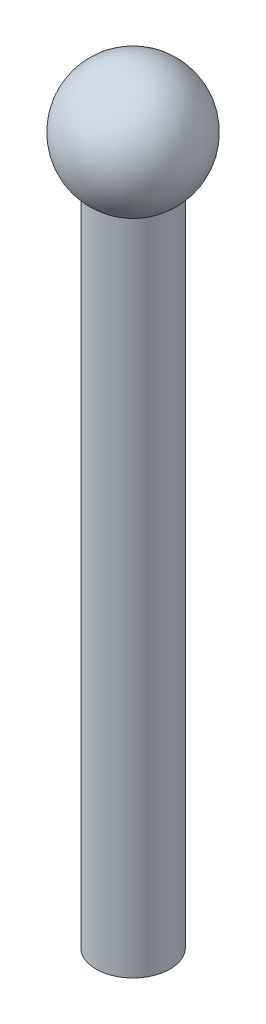
ISO-10303-21;
HEADER;
FILE_DESCRIPTION(('STEP AP214'),'2;1');
FILE_NAME('part.step','',(''),(''),'','','');
FILE_SCHEMA(('AUTOMOTIVE_DESIGN { 1 0 10303 214 1 1 1 1 }'));
ENDSEC;
DATA;
#1=APPLICATION_CONTEXT('core data for automotive mechanical design processes');
#2=APPLICATION_PROTOCOL_DEFINITION('international standard','automotive_design',2000,#1);
#3=PRODUCT_CONTEXT('',#1,'mechanical');
#4=PRODUCT('Part','Part','',(#3));
#5=PRODUCT_RELATED_PRODUCT_CATEGORY('part','',(#4));
#6=PRODUCT_DEFINITION_FORMATION('','',#4);
#7=PRODUCT_DEFINITION_CONTEXT('part definition',#1,'design');
#8=PRODUCT_DEFINITION('design','',#6,#7);
#9=PRODUCT_DEFINITION_SHAPE('','',#8);
#10=(LENGTH_UNIT() NAMED_UNIT(*) SI_UNIT(.MILLI.,.METRE.));
#11=(NAMED_UNIT(*) PLANE_ANGLE_UNIT() SI_UNIT($,.RADIAN.));
#12=(NAMED_UNIT(*) SI_UNIT($,.STERADIAN.) SOLID_ANGLE_UNIT());
#13=UNCERTAINTY_MEASURE_WITH_UNIT(LENGTH_MEASURE(1.E-05),#10,'distance_accuracy_value','');
#14=(GEOMETRIC_REPRESENTATION_CONTEXT(3) GLOBAL_UNCERTAINTY_ASSIGNED_CONTEXT((#13)) GLOBAL_UNIT_ASSIGNED_CONTEXT((#10,
#11,#12)) REPRESENTATION_CONTEXT('',''));
#15=CARTESIAN_POINT('',(0.,0.,0.));
#16=DIRECTION('',(0.,0.,1.));
#17=DIRECTION('',(1.,0.,0.));
#18=AXIS2_PLACEMENT_3D('',#15,#16,#17);
#19=CARTESIAN_POINT('',(0.,120.,0.));
#20=DIRECTION('',(0.,-1.,0.));
#21=DIRECTION('',(0.,0.,-1.));
#22=AXIS2_PLACEMENT_3D('',#19,#20,#21);
#23=CYLINDRICAL_SURFACE('',#22,6.75);
#24=CARTESIAN_POINT('',(0.,120.,0.));
#25=DIRECTION('',(0.,1.,0.));
#26=DIRECTION('',(0.,0.,1.));
#27=AXIS2_PLACEMENT_3D('',#24,#25,#26);
#28=CIRCLE('',#27,6.75);
#29=CARTESIAN_POINT('',(0.,120.,6.75));
#30=VERTEX_POINT('',#29);
#31=EDGE_CURVE('E10',#30,#30,#28,.T.);
#32=ORIENTED_EDGE('',*,*,#31,.F.);
#33=EDGE_LOOP('',(#32));
#34=FACE_BOUND('',#33,.T.);
#35=CARTESIAN_POINT('',(0.,0.,0.));
#36=DIRECTION('',(0.,1.,0.));
#37=DIRECTION('',(0.,0.,1.));
#38=AXIS2_PLACEMENT_3D('',#35,#36,#37);
#39=CIRCLE('',#38,6.75);
#40=CARTESIAN_POINT('',(0.,0.,6.75));
#41=VERTEX_POINT('',#40);
#42=EDGE_CURVE('E45',#41,#41,#39,.T.);
#43=ORIENTED_EDGE('',*,*,#42,.T.);
#44=EDGE_LOOP('',(#43));
#45=FACE_BOUND('',#44,.T.);
#46=ADVANCED_FACE('F37',(#34,#45),#23,.T.);
#47=CARTESIAN_POINT('',(0.,128.8609375,0.));
#48=DIRECTION('',(0.,0.,1.));
#49=DIRECTION('',(1.,0.,0.));
#50=AXIS2_PLACEMENT_3D('',#47,#48,#49);
#51=SPHERICAL_SURFACE('',#50,11.1390625);
#52=CARTESIAN_POINT('',(0.,128.8609375,0.));
#53=DIRECTION('',(0.,1.,0.));
#54=DIRECTION('',(0.,0.,1.));
#55=AXIS2_PLACEMENT_3D('',#52,#53,#54);
#56=SPHERICAL_SURFACE('',#55,11.1390625);
#57=ORIENTED_EDGE('',*,*,#31,.T.);
#58=EDGE_LOOP('',(#57));
#59=FACE_BOUND('',#58,.T.);
#60=ADVANCED_FACE('F39',(#59),#56,.T.);
#61=CARTESIAN_POINT('',(0.,0.,0.));
#62=DIRECTION('',(0.,1.,0.));
#63=DIRECTION('',(0.,0.,1.));
#64=AXIS2_PLACEMENT_3D('',#61,#62,#63);
#65=PLANE('',#64);
#66=ORIENTED_EDGE('',*,*,#42,.F.);
#67=EDGE_LOOP('',(#66));
#68=FACE_BOUND('',#67,.T.);
#69=ADVANCED_FACE('F53',(#68),#65,.F.);
#70=CLOSED_SHELL('',(#46,#60,#69));
#71=MANIFOLD_SOLID_BREP('B2',#70);
#72=ADVANCED_BREP_SHAPE_REPRESENTATION('',(#18,#71),#14);
#73=SHAPE_DEFINITION_REPRESENTATION(#9,#72);
ENDSEC;
END-ISO-10303-21;
